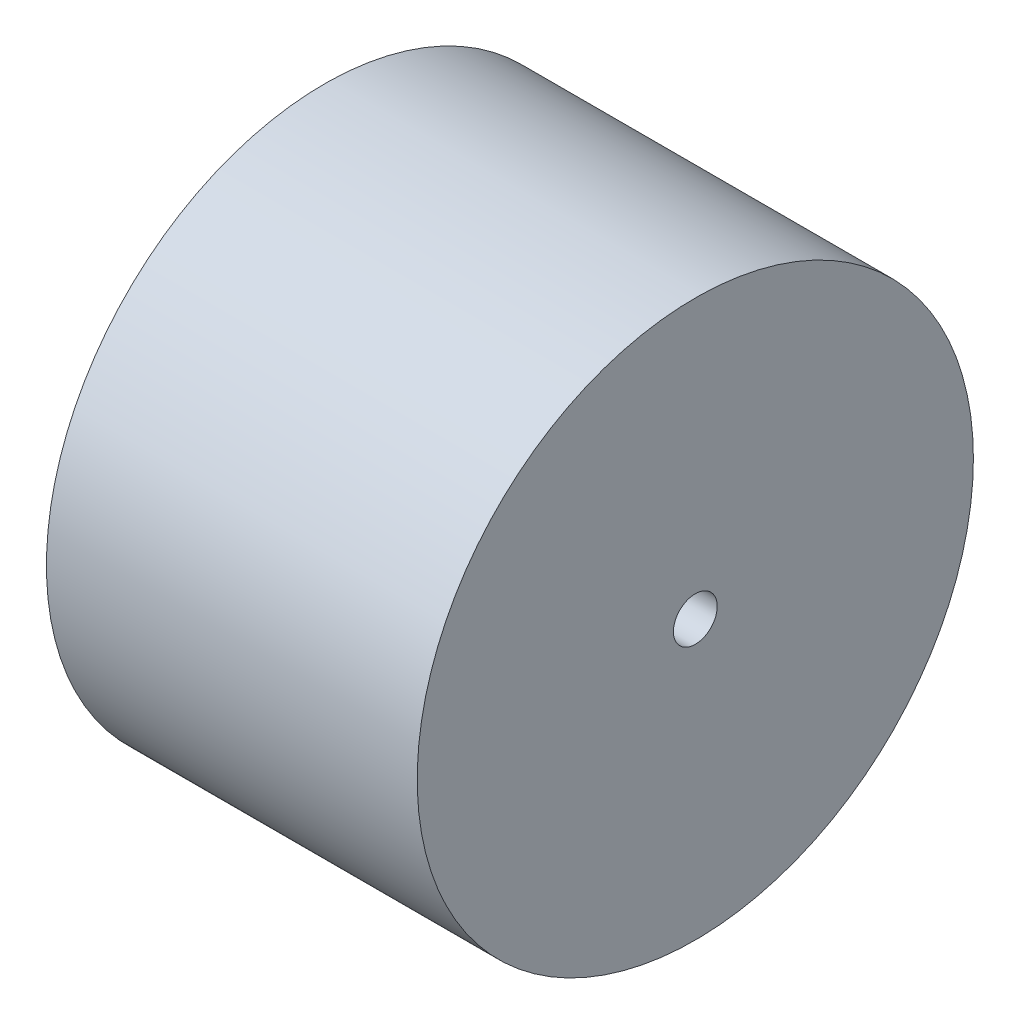
ISO-10303-21;
HEADER;
FILE_DESCRIPTION(('STEP AP214'),'2;1');
FILE_NAME('part.step','',(''),(''),'','','');
FILE_SCHEMA(('AUTOMOTIVE_DESIGN { 1 0 10303 214 1 1 1 1 }'));
ENDSEC;
DATA;
#1=APPLICATION_CONTEXT('core data for automotive mechanical design processes');
#2=APPLICATION_PROTOCOL_DEFINITION('international standard','automotive_design',2000,#1);
#3=PRODUCT_CONTEXT('',#1,'mechanical');
#4=PRODUCT('Part','Part','',(#3));
#5=PRODUCT_RELATED_PRODUCT_CATEGORY('part','',(#4));
#6=PRODUCT_DEFINITION_FORMATION('','',#4);
#7=PRODUCT_DEFINITION_CONTEXT('part definition',#1,'design');
#8=PRODUCT_DEFINITION('design','',#6,#7);
#9=PRODUCT_DEFINITION_SHAPE('','',#8);
#10=(LENGTH_UNIT() NAMED_UNIT(*) SI_UNIT(.MILLI.,.METRE.));
#11=(NAMED_UNIT(*) PLANE_ANGLE_UNIT() SI_UNIT($,.RADIAN.));
#12=(NAMED_UNIT(*) SI_UNIT($,.STERADIAN.) SOLID_ANGLE_UNIT());
#13=UNCERTAINTY_MEASURE_WITH_UNIT(LENGTH_MEASURE(1.E-05),#10,'distance_accuracy_value','');
#14=(GEOMETRIC_REPRESENTATION_CONTEXT(3) GLOBAL_UNCERTAINTY_ASSIGNED_CONTEXT((#13)) GLOBAL_UNIT_ASSIGNED_CONTEXT((#10,
#11,#12)) REPRESENTATION_CONTEXT('',''));
#15=CARTESIAN_POINT('',(0.,0.,0.));
#16=DIRECTION('',(0.,0.,1.));
#17=DIRECTION('',(1.,0.,0.));
#18=AXIS2_PLACEMENT_3D('',#15,#16,#17);
#19=CARTESIAN_POINT('',(12.7,0.,0.));
#20=DIRECTION('',(-1.,0.,0.));
#21=DIRECTION('',(0.,0.,1.));
#22=AXIS2_PLACEMENT_3D('',#19,#20,#21);
#23=CYLINDRICAL_SURFACE('',#22,1.5);
#24=CARTESIAN_POINT('',(12.7,0.,0.));
#25=DIRECTION('',(1.,0.,0.));
#26=DIRECTION('',(0.,0.,-1.));
#27=AXIS2_PLACEMENT_3D('',#24,#25,#26);
#28=CIRCLE('',#27,1.5);
#29=CARTESIAN_POINT('',(12.7,0.,-1.5));
#30=VERTEX_POINT('',#29);
#31=EDGE_CURVE('E44',#30,#30,#28,.T.);
#32=ORIENTED_EDGE('',*,*,#31,.T.);
#33=EDGE_LOOP('',(#32));
#34=FACE_BOUND('',#33,.T.);
#35=CARTESIAN_POINT('',(-12.7,0.,0.));
#36=DIRECTION('',(1.,0.,0.));
#37=DIRECTION('',(0.,0.,-1.));
#38=AXIS2_PLACEMENT_3D('',#35,#36,#37);
#39=CIRCLE('',#38,1.5);
#40=CARTESIAN_POINT('',(-12.7,0.,-1.5));
#41=VERTEX_POINT('',#40);
#42=EDGE_CURVE('E50',#41,#41,#39,.T.);
#43=ORIENTED_EDGE('',*,*,#42,.F.);
#44=EDGE_LOOP('',(#43));
#45=FACE_BOUND('',#44,.T.);
#46=ADVANCED_FACE('F37',(#34,#45),#23,.F.);
#47=CARTESIAN_POINT('',(12.7,0.,0.));
#48=DIRECTION('',(-1.,0.,0.));
#49=DIRECTION('',(0.,0.,1.));
#50=AXIS2_PLACEMENT_3D('',#47,#48,#49);
#51=CYLINDRICAL_SURFACE('',#50,19.05);
#52=CARTESIAN_POINT('',(12.7,0.,0.));
#53=DIRECTION('',(1.,0.,0.));
#54=DIRECTION('',(0.,0.,-1.));
#55=AXIS2_PLACEMENT_3D('',#52,#53,#54);
#56=CIRCLE('',#55,19.05);
#57=CARTESIAN_POINT('',(12.7,0.,-19.05));
#58=VERTEX_POINT('',#57);
#59=EDGE_CURVE('E10',#58,#58,#56,.T.);
#60=ORIENTED_EDGE('',*,*,#59,.F.);
#61=EDGE_LOOP('',(#60));
#62=FACE_BOUND('',#61,.T.);
#63=CARTESIAN_POINT('',(-12.7,0.,0.));
#64=DIRECTION('',(1.,0.,0.));
#65=DIRECTION('',(0.,0.,-1.));
#66=AXIS2_PLACEMENT_3D('',#63,#64,#65);
#67=CIRCLE('',#66,19.05);
#68=CARTESIAN_POINT('',(-12.7,0.,-19.05));
#69=VERTEX_POINT('',#68);
#70=EDGE_CURVE('E40',#69,#69,#67,.T.);
#71=ORIENTED_EDGE('',*,*,#70,.T.);
#72=EDGE_LOOP('',(#71));
#73=FACE_BOUND('',#72,.T.);
#74=ADVANCED_FACE('F57',(#62,#73),#51,.T.);
#75=CARTESIAN_POINT('',(12.7,0.,0.));
#76=DIRECTION('',(1.,0.,0.));
#77=DIRECTION('',(0.,0.,-1.));
#78=AXIS2_PLACEMENT_3D('',#75,#76,#77);
#79=PLANE('',#78);
#80=ORIENTED_EDGE('',*,*,#31,.F.);
#81=EDGE_LOOP('',(#80));
#82=FACE_BOUND('',#81,.T.);
#83=ORIENTED_EDGE('',*,*,#59,.T.);
#84=EDGE_LOOP('',(#83));
#85=FACE_BOUND('',#84,.T.);
#86=ADVANCED_FACE('F61',(#82,#85),#79,.T.);
#87=CARTESIAN_POINT('',(-12.7,0.,0.));
#88=DIRECTION('',(1.,0.,0.));
#89=DIRECTION('',(0.,0.,-1.));
#90=AXIS2_PLACEMENT_3D('',#87,#88,#89);
#91=PLANE('',#90);
#92=ORIENTED_EDGE('',*,*,#42,.T.);
#93=EDGE_LOOP('',(#92));
#94=FACE_BOUND('',#93,.T.);
#95=ORIENTED_EDGE('',*,*,#70,.F.);
#96=EDGE_LOOP('',(#95));
#97=FACE_BOUND('',#96,.T.);
#98=ADVANCED_FACE('F59',(#94,#97),#91,.F.);
#99=CLOSED_SHELL('',(#46,#74,#86,#98));
#100=MANIFOLD_SOLID_BREP('B2',#99);
#101=ADVANCED_BREP_SHAPE_REPRESENTATION('',(#18,#100),#14);
#102=SHAPE_DEFINITION_REPRESENTATION(#9,#101);
ENDSEC;
END-ISO-10303-21;
